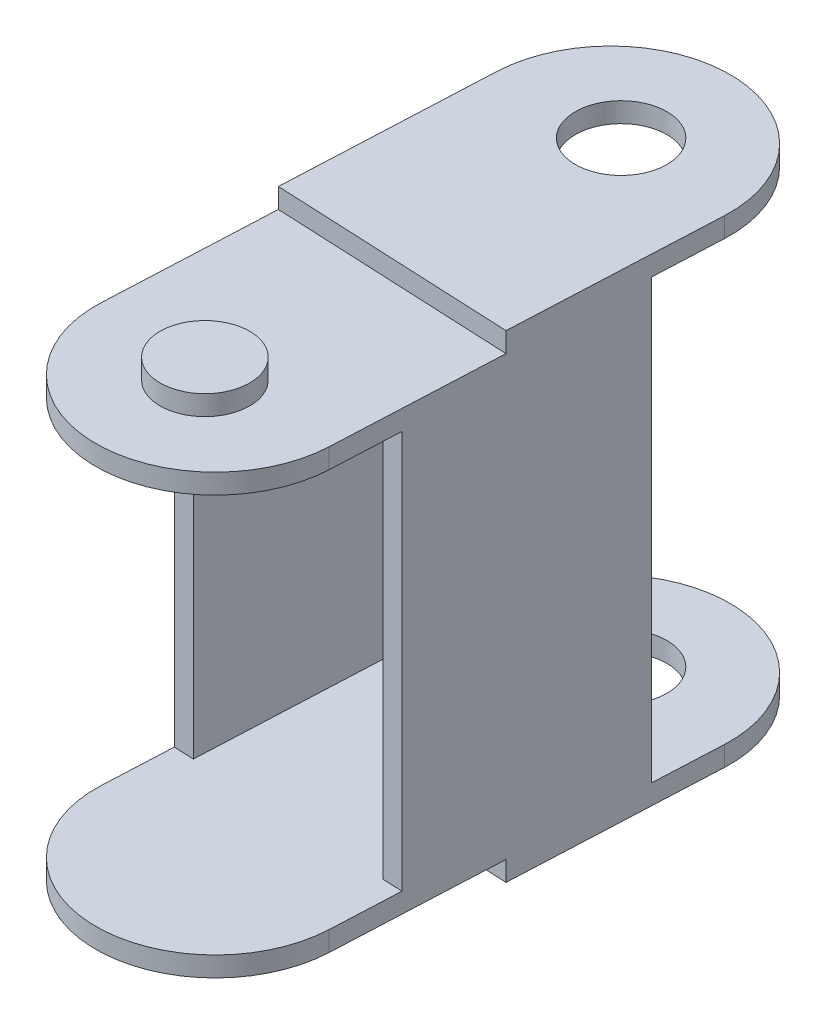
ISO-10303-21;
HEADER;
FILE_DESCRIPTION(('STEP AP214'),'2;1');
FILE_NAME('part.step','',(''),(''),'','','');
FILE_SCHEMA(('AUTOMOTIVE_DESIGN { 1 0 10303 214 1 1 1 1 }'));
ENDSEC;
DATA;
#1=APPLICATION_CONTEXT('core data for automotive mechanical design processes');
#2=APPLICATION_PROTOCOL_DEFINITION('international standard','automotive_design',2000,#1);
#3=PRODUCT_CONTEXT('',#1,'mechanical');
#4=PRODUCT('Part','Part','',(#3));
#5=PRODUCT_RELATED_PRODUCT_CATEGORY('part','',(#4));
#6=PRODUCT_DEFINITION_FORMATION('','',#4);
#7=PRODUCT_DEFINITION_CONTEXT('part definition',#1,'design');
#8=PRODUCT_DEFINITION('design','',#6,#7);
#9=PRODUCT_DEFINITION_SHAPE('','',#8);
#10=(LENGTH_UNIT() NAMED_UNIT(*) SI_UNIT(.MILLI.,.METRE.));
#11=(NAMED_UNIT(*) PLANE_ANGLE_UNIT() SI_UNIT($,.RADIAN.));
#12=(NAMED_UNIT(*) SI_UNIT($,.STERADIAN.) SOLID_ANGLE_UNIT());
#13=UNCERTAINTY_MEASURE_WITH_UNIT(LENGTH_MEASURE(1.E-05),#10,'distance_accuracy_value','');
#14=(GEOMETRIC_REPRESENTATION_CONTEXT(3) GLOBAL_UNCERTAINTY_ASSIGNED_CONTEXT((#13)) GLOBAL_UNIT_ASSIGNED_CONTEXT((#10,
#11,#12)) REPRESENTATION_CONTEXT('',''));
#15=CARTESIAN_POINT('',(0.,0.,0.));
#16=DIRECTION('',(0.,0.,1.));
#17=DIRECTION('',(1.,0.,0.));
#18=AXIS2_PLACEMENT_3D('',#15,#16,#17);
#19=CARTESIAN_POINT('',(-569.3321686826,21.5,46.4624581746));
#20=DIRECTION('',(0.,1.,0.));
#21=DIRECTION('',(-0.046215859100462,0.,0.998931476312368));
#22=AXIS2_PLACEMENT_3D('',#19,#20,#21);
#23=CYLINDRICAL_SURFACE('',#22,2.25);
#24=CARTESIAN_POINT('',(-569.3321686826,21.,46.4624581746));
#25=DIRECTION('',(0.,1.,0.));
#26=DIRECTION('',(-0.046215859100458,0.,0.998931476312368));
#27=AXIS2_PLACEMENT_3D('',#24,#25,#26);
#28=CIRCLE('',#27,2.25);
#29=CARTESIAN_POINT('',(-569.436154365576,21.,48.7100539963028));
#30=VERTEX_POINT('',#29);
#31=EDGE_CURVE('E205',#30,#30,#28,.F.);
#32=ORIENTED_EDGE('',*,*,#31,.F.);
#33=EDGE_LOOP('',(#32));
#34=FACE_BOUND('',#33,.T.);
#35=CARTESIAN_POINT('',(-569.3321686826,22.,46.4624581746));
#36=DIRECTION('',(0.,-1.,0.));
#37=DIRECTION('',(0.046215859100458,0.,-0.998931476312368));
#38=AXIS2_PLACEMENT_3D('',#35,#36,#37);
#39=CIRCLE('',#38,2.25);
#40=CARTESIAN_POINT('',(-569.228182999624,22.,44.2148623528972));
#41=VERTEX_POINT('',#40);
#42=EDGE_CURVE('E202',#41,#41,#39,.F.);
#43=ORIENTED_EDGE('',*,*,#42,.F.);
#44=EDGE_LOOP('',(#43));
#45=FACE_BOUND('',#44,.T.);
#46=ADVANCED_FACE('F17',(#34,#45),#23,.T.);
#47=CARTESIAN_POINT('',(-562.922637092931,21.,37.749370042622));
#48=DIRECTION('',(0.,1.,0.));
#49=DIRECTION('',(-0.998931476312362,0.,-0.046215859100588));
#50=AXIS2_PLACEMENT_3D('',#47,#48,#49);
#51=PLANE('',#50);
#52=CARTESIAN_POINT('',(-569.309060753145,21.,45.962992436339));
#53=DIRECTION('',(0.,1.,0.));
#54=DIRECTION('',(-0.046215859084005,0.,0.998931476313129));
#55=AXIS2_PLACEMENT_3D('',#52,#53,#54);
#56=CIRCLE('',#55,6.);
#57=CARTESIAN_POINT('',(-563.315471895272,21.,46.240287590968));
#58=VERTEX_POINT('',#57);
#59=CARTESIAN_POINT('',(-575.302649610952,21.,45.685697281743));
#60=VERTEX_POINT('',#59);
#61=EDGE_CURVE('E189',#58,#60,#56,.F.);
#62=ORIENTED_EDGE('',*,*,#61,.F.);
#63=DIRECTION('',(0.046215859104167,0.,-0.998931476312196));
#64=VECTOR('',#63,1.);
#65=CARTESIAN_POINT('',(-563.315471895308,21.,46.240287590966));
#66=LINE('',#65,#64);
#67=CARTESIAN_POINT('',(-562.922637092936,21.,37.749370042622));
#68=VERTEX_POINT('',#67);
#69=EDGE_CURVE('E177',#68,#58,#66,.F.);
#70=ORIENTED_EDGE('',*,*,#69,.F.);
#71=DIRECTION('',(-0.998931476312362,0.,-0.046215859100592));
#72=VECTOR('',#71,1.);
#73=CARTESIAN_POINT('',(-562.922637092936,21.,37.749370042622));
#74=LINE('',#73,#72);
#75=CARTESIAN_POINT('',(-574.909814809,21.,37.1947797334));
#76=VERTEX_POINT('',#75);
#77=EDGE_CURVE('E188',#76,#68,#74,.F.);
#78=ORIENTED_EDGE('',*,*,#77,.F.);
#79=DIRECTION('',(-0.046215859055019,0.,0.99893147631447));
#80=VECTOR('',#79,1.);
#81=CARTESIAN_POINT('',(-574.909814809,21.,37.1947797334));
#82=LINE('',#81,#80);
#83=EDGE_CURVE('E201',#60,#76,#82,.F.);
#84=ORIENTED_EDGE('',*,*,#83,.F.);
#85=EDGE_LOOP('',(#62,#70,#78,#84));
#86=FACE_BOUND('',#85,.T.);
#87=ORIENTED_EDGE('',*,*,#31,.T.);
#88=EDGE_LOOP('',(#87));
#89=FACE_BOUND('',#88,.T.);
#90=ADVANCED_FACE('F199',(#86,#89),#51,.T.);
#91=CARTESIAN_POINT('',(-571.535914929974,22.,44.108094455134));
#92=DIRECTION('',(0.,1.,0.));
#93=DIRECTION('',(-0.046215859100588,0.,0.998931476312362));
#94=AXIS2_PLACEMENT_3D('',#91,#92,#93);
#95=PLANE('',#94);
#96=ORIENTED_EDGE('',*,*,#42,.T.);
#97=EDGE_LOOP('',(#96));
#98=FACE_BOUND('',#97,.T.);
#99=ADVANCED_FACE('F629',(#98),#95,.T.);
#100=CARTESIAN_POINT('',(-569.309060752945,-2.,45.962992436349));
#101=DIRECTION('',(0.,1.,0.));
#102=DIRECTION('',(-0.998931476312394,0.,-0.046215859099892));
#103=AXIS2_PLACEMENT_3D('',#100,#101,#102);
#104=CYLINDRICAL_SURFACE('',#103,6.);
#105=DIRECTION('',(-9.09E-13,-1.,2.0755E-11));
#106=VECTOR('',#105,1.);
#107=CARTESIAN_POINT('',(-575.302649610819,21.,45.685697281749));
#108=LINE('',#107,#106);
#109=CARTESIAN_POINT('',(-575.30264961082,20.,45.68569728177));
#110=VERTEX_POINT('',#109);
#111=EDGE_CURVE('E217',#110,#60,#108,.F.);
#112=ORIENTED_EDGE('',*,*,#111,.F.);
#113=CARTESIAN_POINT('',(-569.309060752945,20.,45.962992436349));
#114=DIRECTION('',(0.,1.,0.));
#115=DIRECTION('',(-0.998931476312554,0.,-0.046215859096433));
#116=AXIS2_PLACEMENT_3D('',#113,#114,#115);
#117=CIRCLE('',#116,6.);
#118=CARTESIAN_POINT('',(-563.315471895271,20.,46.240287590952));
#119=VERTEX_POINT('',#118);
#120=EDGE_CURVE('E196',#110,#119,#117,.T.);
#121=ORIENTED_EDGE('',*,*,#120,.T.);
#122=DIRECTION('',(-7.96E-13,1.,1.5696E-11));
#123=VECTOR('',#122,1.);
#124=CARTESIAN_POINT('',(-563.315471895271,20.,46.240287590952));
#125=LINE('',#124,#123);
#126=EDGE_CURVE('E181',#119,#58,#125,.T.);
#127=ORIENTED_EDGE('',*,*,#126,.T.);
#128=ORIENTED_EDGE('',*,*,#61,.T.);
#129=EDGE_LOOP('',(#112,#121,#127,#128));
#130=FACE_BOUND('',#129,.T.);
#131=ADVANCED_FACE('F195',(#130),#104,.T.);
#132=CARTESIAN_POINT('',(-563.315471895176,-2.,46.240287591047));
#133=DIRECTION('',(0.998931476312362,0.,0.046215859100588));
#134=DIRECTION('',(0.046215859100588,0.,-0.998931476312362));
#135=AXIS2_PLACEMENT_3D('',#132,#133,#134);
#136=PLANE('',#135);
#137=DIRECTION('',(0.,-1.,0.));
#138=VECTOR('',#137,1.);
#139=CARTESIAN_POINT('',(-562.922637092831,22.,37.749370042627));
#140=LINE('',#139,#138);
#141=CARTESIAN_POINT('',(-562.922637092831,22.,37.749370042627));
#142=VERTEX_POINT('',#141);
#143=EDGE_CURVE('E184',#142,#68,#140,.T.);
#144=ORIENTED_EDGE('',*,*,#143,.T.);
#145=ORIENTED_EDGE('',*,*,#69,.T.);
#146=ORIENTED_EDGE('',*,*,#126,.F.);
#147=DIRECTION('',(0.046215859100581,0.,-0.998931476312362));
#148=VECTOR('',#147,1.);
#149=CARTESIAN_POINT('',(-563.315471895171,20.,46.240287590957));
#150=LINE('',#149,#148);
#151=CARTESIAN_POINT('',(-563.153716388336,20.,42.744027424217));
#152=VERTEX_POINT('',#151);
#153=EDGE_CURVE('E229',#119,#152,#150,.T.);
#154=ORIENTED_EDGE('',*,*,#153,.T.);
#155=DIRECTION('',(0.,-1.,0.));
#156=VECTOR('',#155,1.);
#157=CARTESIAN_POINT('',(-563.153716388336,20.,42.744027424217));
#158=LINE('',#157,#156);
#159=CARTESIAN_POINT('',(-563.153716388336,0.,42.744027424217));
#160=VERTEX_POINT('',#159);
#161=EDGE_CURVE('E233',#152,#160,#158,.T.);
#162=ORIENTED_EDGE('',*,*,#161,.T.);
#163=DIRECTION('',(-0.046215859100602,0.,0.998931476312361));
#164=VECTOR('',#163,1.);
#165=CARTESIAN_POINT('',(-563.153716388336,0.,42.744027424217));
#166=LINE('',#165,#164);
#167=CARTESIAN_POINT('',(-563.315471895172,0.,46.240287590972));
#168=VERTEX_POINT('',#167);
#169=EDGE_CURVE('E238',#160,#168,#166,.T.);
#170=ORIENTED_EDGE('',*,*,#169,.T.);
#171=DIRECTION('',(-1.14E-13,-1.,4.214E-12));
#172=VECTOR('',#171,1.);
#173=CARTESIAN_POINT('',(-563.315471895172,0.,46.240287590972));
#174=LINE('',#173,#172);
#175=CARTESIAN_POINT('',(-563.315471895172,-1.,46.240287590977));
#176=VERTEX_POINT('',#175);
#177=EDGE_CURVE('E243',#176,#168,#174,.F.);
#178=ORIENTED_EDGE('',*,*,#177,.F.);
#179=DIRECTION('',(0.046215859100586,0.,-0.998931476312362));
#180=VECTOR('',#179,1.);
#181=CARTESIAN_POINT('',(-563.315471895172,-1.,46.240287590977));
#182=LINE('',#181,#180);
#183=CARTESIAN_POINT('',(-562.922637092831,-1.,37.749370042627));
#184=VERTEX_POINT('',#183);
#185=EDGE_CURVE('E247',#176,#184,#182,.T.);
#186=ORIENTED_EDGE('',*,*,#185,.T.);
#187=DIRECTION('',(0.,-1.,0.));
#188=VECTOR('',#187,1.);
#189=CARTESIAN_POINT('',(-562.922637092831,-1.,37.749370042627));
#190=LINE('',#189,#188);
#191=CARTESIAN_POINT('',(-562.922637092831,-2.,37.749370042627));
#192=VERTEX_POINT('',#191);
#193=EDGE_CURVE('E252',#184,#192,#190,.T.);
#194=ORIENTED_EDGE('',*,*,#193,.T.);
#195=DIRECTION('',(0.046215859100592,0.,-0.998931476312362));
#196=VECTOR('',#195,1.);
#197=CARTESIAN_POINT('',(-562.922637092831,-2.,37.749370042627));
#198=LINE('',#197,#196);
#199=CARTESIAN_POINT('',(-562.437370572264,-2.,27.260589541112));
#200=VERTEX_POINT('',#199);
#201=EDGE_CURVE('E257',#192,#200,#198,.T.);
#202=ORIENTED_EDGE('',*,*,#201,.T.);
#203=DIRECTION('',(0.,1.,0.));
#204=VECTOR('',#203,1.);
#205=CARTESIAN_POINT('',(-562.437370572264,-2.,27.260589541112));
#206=LINE('',#205,#204);
#207=CARTESIAN_POINT('',(-562.437370572264,-1.,27.260589541112));
#208=VERTEX_POINT('',#207);
#209=EDGE_CURVE('E262',#200,#208,#206,.T.);
#210=ORIENTED_EDGE('',*,*,#209,.T.);
#211=DIRECTION('',(-0.046215859100593,0.,0.998931476312362));
#212=VECTOR('',#211,1.);
#213=CARTESIAN_POINT('',(-562.437370572264,-1.,27.260589541112));
#214=LINE('',#213,#212);
#215=CARTESIAN_POINT('',(-562.599126079129,-1.,30.756849708475));
#216=VERTEX_POINT('',#215);
#217=EDGE_CURVE('E267',#208,#216,#214,.T.);
#218=ORIENTED_EDGE('',*,*,#217,.T.);
#219=DIRECTION('',(0.,1.,0.));
#220=VECTOR('',#219,1.);
#221=CARTESIAN_POINT('',(-562.599126079129,-1.,30.756849708475));
#222=LINE('',#221,#220);
#223=CARTESIAN_POINT('',(-562.599126079129,21.,30.756849708475));
#224=VERTEX_POINT('',#223);
#225=EDGE_CURVE('E272',#216,#224,#222,.T.);
#226=ORIENTED_EDGE('',*,*,#225,.T.);
#227=DIRECTION('',(0.046215859100593,0.,-0.998931476312362));
#228=VECTOR('',#227,1.);
#229=CARTESIAN_POINT('',(-562.599126079129,21.,30.756849708475));
#230=LINE('',#229,#228);
#231=CARTESIAN_POINT('',(-562.437370572264,21.,27.260589541112));
#232=VERTEX_POINT('',#231);
#233=EDGE_CURVE('E277',#224,#232,#230,.T.);
#234=ORIENTED_EDGE('',*,*,#233,.T.);
#235=DIRECTION('',(0.,1.,0.));
#236=VECTOR('',#235,1.);
#237=CARTESIAN_POINT('',(-562.437370572264,21.,27.260589541112));
#238=LINE('',#237,#236);
#239=CARTESIAN_POINT('',(-562.437370572264,22.,27.260589541112));
#240=VERTEX_POINT('',#239);
#241=EDGE_CURVE('E282',#232,#240,#238,.T.);
#242=ORIENTED_EDGE('',*,*,#241,.T.);
#243=DIRECTION('',(-0.046215859100592,0.,0.998931476312362));
#244=VECTOR('',#243,1.);
#245=CARTESIAN_POINT('',(-562.437370572264,22.,27.260589541112));
#246=LINE('',#245,#244);
#247=EDGE_CURVE('E287',#240,#142,#246,.T.);
#248=ORIENTED_EDGE('',*,*,#247,.T.);
#249=EDGE_LOOP('',(#144,#145,#146,#154,#162,#170,#178,#186,#194,#202,#210,#218,#226,#234,#242,#248));
#250=FACE_BOUND('',#249,.T.);
#251=ADVANCED_FACE('F179',(#250),#136,.T.);
#252=CARTESIAN_POINT('',(-574.909814809,21.,37.1947797334));
#253=DIRECTION('',(-0.046215859100588,0.,0.998931476312362));
#254=DIRECTION('',(0.998931476312362,0.,0.046215859100588));
#255=AXIS2_PLACEMENT_3D('',#252,#253,#254);
#256=PLANE('',#255);
#257=DIRECTION('',(-0.998931476312362,0.,-0.046215859100589));
#258=VECTOR('',#257,1.);
#259=CARTESIAN_POINT('',(-562.922637092937,22.,37.749370042622));
#260=LINE('',#259,#258);
#261=CARTESIAN_POINT('',(-574.909814808918,22.,37.194779733404));
#262=VERTEX_POINT('',#261);
#263=EDGE_CURVE('E291',#262,#142,#260,.F.);
#264=ORIENTED_EDGE('',*,*,#263,.F.);
#265=DIRECTION('',(-8.1627E-11,-1.,-3.773E-12));
#266=VECTOR('',#265,1.);
#267=CARTESIAN_POINT('',(-574.909814808918,22.,37.194779733404));
#268=LINE('',#267,#266);
#269=EDGE_CURVE('E295',#76,#262,#268,.F.);
#270=ORIENTED_EDGE('',*,*,#269,.F.);
#271=ORIENTED_EDGE('',*,*,#77,.T.);
#272=ORIENTED_EDGE('',*,*,#143,.F.);
#273=EDGE_LOOP('',(#264,#270,#271,#272));
#274=FACE_BOUND('',#273,.T.);
#275=ADVANCED_FACE('F613',(#274),#256,.T.);
#276=CARTESIAN_POINT('',(-574.424548288013,-2.,26.705999231905));
#277=DIRECTION('',(-0.998931476312362,0.,-0.046215859100588));
#278=DIRECTION('',(-0.046215859100588,0.,0.998931476312362));
#279=AXIS2_PLACEMENT_3D('',#276,#277,#278);
#280=PLANE('',#279);
#281=ORIENTED_EDGE('',*,*,#83,.T.);
#282=ORIENTED_EDGE('',*,*,#269,.T.);
#283=DIRECTION('',(0.046215859100592,0.,-0.998931476312362));
#284=VECTOR('',#283,1.);
#285=CARTESIAN_POINT('',(-574.90981480858,22.,37.194779733419));
#286=LINE('',#285,#284);
#287=CARTESIAN_POINT('',(-574.424548288013,22.,26.705999231905));
#288=VERTEX_POINT('',#287);
#289=EDGE_CURVE('E300',#262,#288,#286,.T.);
#290=ORIENTED_EDGE('',*,*,#289,.T.);
#291=DIRECTION('',(0.,-1.,0.));
#292=VECTOR('',#291,1.);
#293=CARTESIAN_POINT('',(-574.424548288013,22.,26.705999231905));
#294=LINE('',#293,#292);
#295=CARTESIAN_POINT('',(-574.424548288013,21.,26.705999231905));
#296=VERTEX_POINT('',#295);
#297=EDGE_CURVE('E305',#296,#288,#294,.F.);
#298=ORIENTED_EDGE('',*,*,#297,.F.);
#299=DIRECTION('',(-0.046215859100593,0.,0.998931476312362));
#300=VECTOR('',#299,1.);
#301=CARTESIAN_POINT('',(-574.424548288013,21.,26.705999231905));
#302=LINE('',#301,#300);
#303=CARTESIAN_POINT('',(-574.586303794877,21.,30.202259399268));
#304=VERTEX_POINT('',#303);
#305=EDGE_CURVE('E310',#296,#304,#302,.T.);
#306=ORIENTED_EDGE('',*,*,#305,.T.);
#307=DIRECTION('',(0.,-1.,0.));
#308=VECTOR('',#307,1.);
#309=CARTESIAN_POINT('',(-574.586303794877,21.,30.202259399268));
#310=LINE('',#309,#308);
#311=CARTESIAN_POINT('',(-574.586303794877,-1.,30.202259399268));
#312=VERTEX_POINT('',#311);
#313=EDGE_CURVE('E315',#304,#312,#310,.T.);
#314=ORIENTED_EDGE('',*,*,#313,.T.);
#315=DIRECTION('',(0.046215859100592,0.,-0.998931476312362));
#316=VECTOR('',#315,1.);
#317=CARTESIAN_POINT('',(-574.586303794877,-1.,30.202259399268));
#318=LINE('',#317,#316);
#319=CARTESIAN_POINT('',(-574.424548288013,-1.,26.705999231905));
#320=VERTEX_POINT('',#319);
#321=EDGE_CURVE('E320',#312,#320,#318,.T.);
#322=ORIENTED_EDGE('',*,*,#321,.T.);
#323=DIRECTION('',(0.,-1.,0.));
#324=VECTOR('',#323,1.);
#325=CARTESIAN_POINT('',(-574.424548288013,-1.,26.705999231905));
#326=LINE('',#325,#324);
#327=CARTESIAN_POINT('',(-574.424548288013,-2.,26.705999231905));
#328=VERTEX_POINT('',#327);
#329=EDGE_CURVE('E325',#328,#320,#326,.F.);
#330=ORIENTED_EDGE('',*,*,#329,.F.);
#331=DIRECTION('',(-0.046215859100592,0.,0.998931476312362));
#332=VECTOR('',#331,1.);
#333=CARTESIAN_POINT('',(-574.424548288013,-2.,26.705999231905));
#334=LINE('',#333,#332);
#335=CARTESIAN_POINT('',(-574.90981480858,-2.,37.194779733419));
#336=VERTEX_POINT('',#335);
#337=EDGE_CURVE('E330',#328,#336,#334,.T.);
#338=ORIENTED_EDGE('',*,*,#337,.T.);
#339=DIRECTION('',(0.,1.,0.));
#340=VECTOR('',#339,1.);
#341=CARTESIAN_POINT('',(-574.90981480858,-2.,37.194779733419));
#342=LINE('',#341,#340);
#343=CARTESIAN_POINT('',(-574.90981480858,-1.,37.194779733419));
#344=VERTEX_POINT('',#343);
#345=EDGE_CURVE('E335',#336,#344,#342,.T.);
#346=ORIENTED_EDGE('',*,*,#345,.T.);
#347=DIRECTION('',(-0.046215859100588,0.,0.998931476312362));
#348=VECTOR('',#347,1.);
#349=CARTESIAN_POINT('',(-574.90981480858,-1.,37.194779733419));
#350=LINE('',#349,#348);
#351=CARTESIAN_POINT('',(-575.302649610919,-1.,45.685697281745));
#352=VERTEX_POINT('',#351);
#353=EDGE_CURVE('E340',#344,#352,#350,.T.);
#354=ORIENTED_EDGE('',*,*,#353,.T.);
#355=DIRECTION('',(-2.27E-13,1.,4.988E-12));
#356=VECTOR('',#355,1.);
#357=CARTESIAN_POINT('',(-575.302649610919,-1.,45.685697281745));
#358=LINE('',#357,#356);
#359=CARTESIAN_POINT('',(-575.30264961092,0.,45.68569728175));
#360=VERTEX_POINT('',#359);
#361=EDGE_CURVE('E345',#352,#360,#358,.T.);
#362=ORIENTED_EDGE('',*,*,#361,.T.);
#363=DIRECTION('',(0.046215859100614,0.,-0.998931476312361));
#364=VECTOR('',#363,1.);
#365=CARTESIAN_POINT('',(-575.30264961092,0.,45.68569728175));
#366=LINE('',#365,#364);
#367=CARTESIAN_POINT('',(-575.140894104084,0.,42.18943711501));
#368=VERTEX_POINT('',#367);
#369=EDGE_CURVE('E350',#360,#368,#366,.T.);
#370=ORIENTED_EDGE('',*,*,#369,.T.);
#371=DIRECTION('',(0.,1.,0.));
#372=VECTOR('',#371,1.);
#373=CARTESIAN_POINT('',(-575.140894104084,0.,42.18943711501));
#374=LINE('',#373,#372);
#375=CARTESIAN_POINT('',(-575.140894104084,20.,42.18943711501));
#376=VERTEX_POINT('',#375);
#377=EDGE_CURVE('E355',#368,#376,#374,.T.);
#378=ORIENTED_EDGE('',*,*,#377,.T.);
#379=DIRECTION('',(-0.046215859100601,0.,0.998931476312361));
#380=VECTOR('',#379,1.);
#381=CARTESIAN_POINT('',(-575.140894104084,20.,42.18943711501));
#382=LINE('',#381,#380);
#383=EDGE_CURVE('E360',#376,#110,#382,.T.);
#384=ORIENTED_EDGE('',*,*,#383,.T.);
#385=ORIENTED_EDGE('',*,*,#111,.T.);
#386=EDGE_LOOP('',(#281,#282,#290,#298,#306,#314,#322,#330,#338,#346,#354,#362,#370,#378,#384,#385));
#387=FACE_BOUND('',#386,.T.);
#388=ADVANCED_FACE('F555',(#387),#280,.T.);
#389=CARTESIAN_POINT('',(-574.586303794931,20.,30.202259399266));
#390=DIRECTION('',(0.,-1.,0.));
#391=DIRECTION('',(0.998931476312362,0.,0.046215859100588));
#392=AXIS2_PLACEMENT_3D('',#389,#390,#391);
#393=PLANE('',#392);
#394=CARTESIAN_POINT('',(-568.407851500588,20.,26.483828648353));
#395=DIRECTION('',(0.,1.,0.));
#396=DIRECTION('',(-0.046215859100621,0.,0.99893147631236));
#397=AXIS2_PLACEMENT_3D('',#394,#395,#396);
#398=CIRCLE('',#397,6.2);
#399=CARTESIAN_POINT('',(-573.324740959274,20.,30.260625975595));
#400=VERTEX_POINT('',#399);
#401=CARTESIAN_POINT('',(-563.860688914732,20.,30.69848313215));
#402=VERTEX_POINT('',#401);
#403=EDGE_CURVE('E365',#400,#402,#398,.T.);
#404=ORIENTED_EDGE('',*,*,#403,.T.);
#405=DIRECTION('',(0.998931476312386,0.,0.046215859100066));
#406=VECTOR('',#405,1.);
#407=CARTESIAN_POINT('',(-563.860688914732,20.,30.698483132149));
#408=LINE('',#407,#406);
#409=CARTESIAN_POINT('',(-563.598057555441,20.,30.710633849375));
#410=VERTEX_POINT('',#409);
#411=EDGE_CURVE('E370',#402,#410,#408,.T.);
#412=ORIENTED_EDGE('',*,*,#411,.T.);
#413=DIRECTION('',(-0.04621585910062,0.,0.99893147631236));
#414=VECTOR('',#413,1.);
#415=CARTESIAN_POINT('',(-563.598057555441,20.,30.710633849375));
#416=LINE('',#415,#414);
#417=CARTESIAN_POINT('',(-564.152647864648,20.,42.697811565116));
#418=VERTEX_POINT('',#417);
#419=EDGE_CURVE('E375',#418,#410,#416,.F.);
#420=ORIENTED_EDGE('',*,*,#419,.F.);
#421=DIRECTION('',(0.998931476312364,0.,0.046215859100552));
#422=VECTOR('',#421,1.);
#423=CARTESIAN_POINT('',(-564.152647864648,20.,42.697811565116));
#424=LINE('',#423,#422);
#425=EDGE_CURVE('E379',#152,#418,#424,.F.);
#426=ORIENTED_EDGE('',*,*,#425,.F.);
#427=ORIENTED_EDGE('',*,*,#153,.F.);
#428=ORIENTED_EDGE('',*,*,#120,.F.);
#429=ORIENTED_EDGE('',*,*,#383,.F.);
#430=DIRECTION('',(0.998931476312361,0.,0.046215859100605));
#431=VECTOR('',#430,1.);
#432=CARTESIAN_POINT('',(-575.140894104138,20.,42.189437115007));
#433=LINE('',#432,#431);
#434=CARTESIAN_POINT('',(-574.141962627772,20.,42.235652974111));
#435=VERTEX_POINT('',#434);
#436=EDGE_CURVE('E384',#435,#376,#433,.F.);
#437=ORIENTED_EDGE('',*,*,#436,.F.);
#438=DIRECTION('',(0.04621585910063,0.,-0.99893147631236));
#439=VECTOR('',#438,1.);
#440=CARTESIAN_POINT('',(-574.141962627772,20.,42.235652974111));
#441=LINE('',#440,#439);
#442=CARTESIAN_POINT('',(-573.587372318565,20.,30.248475258369));
#443=VERTEX_POINT('',#442);
#444=EDGE_CURVE('E388',#443,#435,#441,.F.);
#445=ORIENTED_EDGE('',*,*,#444,.F.);
#446=DIRECTION('',(0.998931476312351,0.,0.046215859100828));
#447=VECTOR('',#446,1.);
#448=CARTESIAN_POINT('',(-573.587372318565,20.,30.248475258369));
#449=LINE('',#448,#447);
#450=EDGE_CURVE('E392',#443,#400,#449,.T.);
#451=ORIENTED_EDGE('',*,*,#450,.T.);
#452=EDGE_LOOP('',(#404,#412,#420,#426,#427,#428,#429,#437,#445,#451));
#453=FACE_BOUND('',#452,.T.);
#454=ADVANCED_FACE('F557',(#453),#393,.T.);
#455=CARTESIAN_POINT('',(-564.152647864648,20.,42.697811565116));
#456=DIRECTION('',(-0.046215859100588,0.,0.998931476312362));
#457=DIRECTION('',(0.,-1.,0.));
#458=AXIS2_PLACEMENT_3D('',#455,#456,#457);
#459=PLANE('',#458);
#460=DIRECTION('',(0.,-1.,0.));
#461=VECTOR('',#460,1.);
#462=CARTESIAN_POINT('',(-564.152647864648,20.,42.697811565116));
#463=LINE('',#462,#461);
#464=CARTESIAN_POINT('',(-564.152647864648,0.,42.697811565116));
#465=VERTEX_POINT('',#464);
#466=EDGE_CURVE('E397',#465,#418,#463,.F.);
#467=ORIENTED_EDGE('',*,*,#466,.F.);
#468=DIRECTION('',(0.998931476312362,0.,0.046215859100586));
#469=VECTOR('',#468,1.);
#470=CARTESIAN_POINT('',(-564.152647864648,0.,42.697811565116));
#471=LINE('',#470,#469);
#472=EDGE_CURVE('E401',#465,#160,#471,.T.);
#473=ORIENTED_EDGE('',*,*,#472,.T.);
#474=ORIENTED_EDGE('',*,*,#161,.F.);
#475=ORIENTED_EDGE('',*,*,#425,.T.);
#476=EDGE_LOOP('',(#467,#473,#474,#475));
#477=FACE_BOUND('',#476,.T.);
#478=ADVANCED_FACE('F563',(#477),#459,.T.);
#479=CARTESIAN_POINT('',(-574.586303795039,0.,30.202259399261));
#480=DIRECTION('',(0.,1.,0.));
#481=DIRECTION('',(-0.046215859100588,0.,0.998931476312362));
#482=AXIS2_PLACEMENT_3D('',#479,#480,#481);
#483=PLANE('',#482);
#484=CARTESIAN_POINT('',(-568.407851500588,0.,26.483828648353));
#485=DIRECTION('',(0.,-1.,0.));
#486=DIRECTION('',(-0.046215859100621,0.,0.99893147631236));
#487=AXIS2_PLACEMENT_3D('',#484,#485,#486);
#488=CIRCLE('',#487,6.2);
#489=CARTESIAN_POINT('',(-563.860688914732,0.,30.69848313215));
#490=VERTEX_POINT('',#489);
#491=CARTESIAN_POINT('',(-573.324740959274,0.,30.260625975595));
#492=VERTEX_POINT('',#491);
#493=EDGE_CURVE('E406',#490,#492,#488,.T.);
#494=ORIENTED_EDGE('',*,*,#493,.T.);
#495=DIRECTION('',(-0.998931476312357,0.,-0.046215859100694));
#496=VECTOR('',#495,1.);
#497=CARTESIAN_POINT('',(-573.324740959274,0.,30.260625975595));
#498=LINE('',#497,#496);
#499=CARTESIAN_POINT('',(-573.587372318565,0.,30.248475258369));
#500=VERTEX_POINT('',#499);
#501=EDGE_CURVE('E411',#492,#500,#498,.T.);
#502=ORIENTED_EDGE('',*,*,#501,.T.);
#503=DIRECTION('',(-0.046215859100591,0.,0.998931476312362));
#504=VECTOR('',#503,1.);
#505=CARTESIAN_POINT('',(-573.587372318565,0.,30.248475258369));
#506=LINE('',#505,#504);
#507=CARTESIAN_POINT('',(-574.141962627772,0.,42.235652974111));
#508=VERTEX_POINT('',#507);
#509=EDGE_CURVE('E416',#508,#500,#506,.F.);
#510=ORIENTED_EDGE('',*,*,#509,.F.);
#511=DIRECTION('',(-0.99893147631236,0.,-0.046215859100639));
#512=VECTOR('',#511,1.);
#513=CARTESIAN_POINT('',(-574.141962627772,0.,42.235652974111));
#514=LINE('',#513,#512);
#515=EDGE_CURVE('E420',#368,#508,#514,.F.);
#516=ORIENTED_EDGE('',*,*,#515,.F.);
#517=ORIENTED_EDGE('',*,*,#369,.F.);
#518=CARTESIAN_POINT('',(-569.309060753145,0.,45.962992436339));
#519=DIRECTION('',(0.,1.,0.));
#520=DIRECTION('',(-0.046215859083986,0.,0.99893147631313));
#521=AXIS2_PLACEMENT_3D('',#518,#519,#520);
#522=CIRCLE('',#521,6.);
#523=EDGE_CURVE('E425',#168,#360,#522,.F.);
#524=ORIENTED_EDGE('',*,*,#523,.F.);
#525=ORIENTED_EDGE('',*,*,#169,.F.);
#526=ORIENTED_EDGE('',*,*,#472,.F.);
#527=DIRECTION('',(0.046215859100601,0.,-0.998931476312361));
#528=VECTOR('',#527,1.);
#529=CARTESIAN_POINT('',(-564.152647864648,0.,42.697811565116));
#530=LINE('',#529,#528);
#531=CARTESIAN_POINT('',(-563.598057555441,0.,30.710633849375));
#532=VERTEX_POINT('',#531);
#533=EDGE_CURVE('E429',#532,#465,#530,.F.);
#534=ORIENTED_EDGE('',*,*,#533,.F.);
#535=DIRECTION('',(-0.998931476312414,0.,-0.046215859099466));
#536=VECTOR('',#535,1.);
#537=CARTESIAN_POINT('',(-563.598057555441,0.,30.710633849375));
#538=LINE('',#537,#536);
#539=EDGE_CURVE('E433',#532,#490,#538,.T.);
#540=ORIENTED_EDGE('',*,*,#539,.T.);
#541=EDGE_LOOP('',(#494,#502,#510,#516,#517,#524,#525,#526,#534,#540));
#542=FACE_BOUND('',#541,.T.);
#543=ADVANCED_FACE('F549',(#542),#483,.T.);
#544=CARTESIAN_POINT('',(-569.309060753145,-2.,45.962992436339));
#545=DIRECTION('',(0.,1.,0.));
#546=DIRECTION('',(-0.046215859084011,0.,0.998931476313129));
#547=AXIS2_PLACEMENT_3D('',#544,#545,#546);
#548=CYLINDRICAL_SURFACE('',#547,6.);
#549=ORIENTED_EDGE('',*,*,#177,.T.);
#550=ORIENTED_EDGE('',*,*,#523,.T.);
#551=ORIENTED_EDGE('',*,*,#361,.F.);
#552=CARTESIAN_POINT('',(-569.309060752945,-1.,45.962992436349));
#553=DIRECTION('',(0.,-1.,0.));
#554=DIRECTION('',(-0.046215859117335,0.,0.998931476311587));
#555=AXIS2_PLACEMENT_3D('',#552,#553,#554);
#556=CIRCLE('',#555,6.);
#557=EDGE_CURVE('E438',#352,#176,#556,.F.);
#558=ORIENTED_EDGE('',*,*,#557,.T.);
#559=EDGE_LOOP('',(#549,#550,#551,#558));
#560=FACE_BOUND('',#559,.T.);
#561=ADVANCED_FACE('F570',(#560),#548,.T.);
#562=CARTESIAN_POINT('',(-574.909814808685,-1.,37.194779733415));
#563=DIRECTION('',(0.,-1.,0.));
#564=DIRECTION('',(0.998931476312362,0.,0.046215859100588));
#565=AXIS2_PLACEMENT_3D('',#562,#563,#564);
#566=PLANE('',#565);
#567=ORIENTED_EDGE('',*,*,#557,.F.);
#568=ORIENTED_EDGE('',*,*,#353,.F.);
#569=DIRECTION('',(0.998931476312362,0.,0.046215859100591));
#570=VECTOR('',#569,1.);
#571=CARTESIAN_POINT('',(-574.909814808685,-1.,37.194779733415));
#572=LINE('',#571,#570);
#573=EDGE_CURVE('E443',#344,#184,#572,.T.);
#574=ORIENTED_EDGE('',*,*,#573,.T.);
#575=ORIENTED_EDGE('',*,*,#185,.F.);
#576=EDGE_LOOP('',(#567,#568,#574,#575));
#577=FACE_BOUND('',#576,.T.);
#578=CARTESIAN_POINT('',(-569.3321686826,-1.,46.4624581746));
#579=DIRECTION('',(0.,1.,0.));
#580=DIRECTION('',(-0.046215859100509,0.,0.998931476312366));
#581=AXIS2_PLACEMENT_3D('',#578,#579,#580);
#582=CIRCLE('',#581,2.25);
#583=CARTESIAN_POINT('',(-569.436154365576,-1.,48.7100539963028));
#584=VERTEX_POINT('',#583);
#585=EDGE_CURVE('E448',#584,#584,#582,.T.);
#586=ORIENTED_EDGE('',*,*,#585,.T.);
#587=EDGE_LOOP('',(#586));
#588=FACE_BOUND('',#587,.T.);
#589=ADVANCED_FACE('F574',(#577,#588),#566,.T.);
#590=CARTESIAN_POINT('',(-574.909814808685,-2.,37.194779733415));
#591=DIRECTION('',(-0.046215859100588,0.,0.998931476312362));
#592=DIRECTION('',(0.998931476312362,0.,0.046215859100588));
#593=AXIS2_PLACEMENT_3D('',#590,#591,#592);
#594=PLANE('',#593);
#595=ORIENTED_EDGE('',*,*,#573,.F.);
#596=ORIENTED_EDGE('',*,*,#345,.F.);
#597=DIRECTION('',(0.998931476312362,0.,0.046215859100588));
#598=VECTOR('',#597,1.);
#599=CARTESIAN_POINT('',(-574.909814808685,-2.,37.194779733415));
#600=LINE('',#599,#598);
#601=EDGE_CURVE('E453',#192,#336,#600,.F.);
#602=ORIENTED_EDGE('',*,*,#601,.F.);
#603=ORIENTED_EDGE('',*,*,#193,.F.);
#604=EDGE_LOOP('',(#595,#596,#602,#603));
#605=FACE_BOUND('',#604,.T.);
#606=ADVANCED_FACE('F578',(#605),#594,.T.);
#607=CARTESIAN_POINT('',(-574.147253133834,-2.,20.712410374112));
#608=DIRECTION('',(0.,-1.,0.));
#609=DIRECTION('',(0.998931476312362,0.,0.046215859100588));
#610=AXIS2_PLACEMENT_3D('',#607,#608,#609);
#611=PLANE('',#610);
#612=ORIENTED_EDGE('',*,*,#601,.T.);
#613=ORIENTED_EDGE('',*,*,#337,.F.);
#614=CARTESIAN_POINT('',(-568.430959430243,-2.,26.983294386604));
#615=DIRECTION('',(0.,-1.,0.));
#616=DIRECTION('',(0.046215859117164,0.,-0.998931476311595));
#617=AXIS2_PLACEMENT_3D('',#614,#615,#616);
#618=CIRCLE('',#617,6.);
#619=EDGE_CURVE('E455',#200,#328,#618,.F.);
#620=ORIENTED_EDGE('',*,*,#619,.F.);
#621=ORIENTED_EDGE('',*,*,#201,.F.);
#622=EDGE_LOOP('',(#612,#613,#620,#621));
#623=FACE_BOUND('',#622,.T.);
#624=CARTESIAN_POINT('',(-568.4078515014,-2.,26.4838286483));
#625=DIRECTION('',(0.,1.,0.));
#626=DIRECTION('',(-0.046215859100436,0.,0.998931476312369));
#627=AXIS2_PLACEMENT_3D('',#624,#625,#626);
#628=CIRCLE('',#627,2.3);
#629=CARTESIAN_POINT('',(-568.514147977331,-2.,28.7813710438184));
#630=VERTEX_POINT('',#629);
#631=EDGE_CURVE('E459',#630,#630,#628,.T.);
#632=ORIENTED_EDGE('',*,*,#631,.T.);
#633=EDGE_LOOP('',(#632));
#634=FACE_BOUND('',#633,.T.);
#635=ADVANCED_FACE('F581',(#623,#634),#611,.T.);
#636=CARTESIAN_POINT('',(-568.430959430243,-2.,26.983294386604));
#637=DIRECTION('',(0.,1.,0.));
#638=DIRECTION('',(0.998931476313132,0.,0.046215859083943));
#639=AXIS2_PLACEMENT_3D('',#636,#637,#638);
#640=CYLINDRICAL_SURFACE('',#639,6.);
#641=ORIENTED_EDGE('',*,*,#209,.F.);
#642=ORIENTED_EDGE('',*,*,#619,.T.);
#643=ORIENTED_EDGE('',*,*,#329,.T.);
#644=CARTESIAN_POINT('',(-568.430959430043,-1.,26.983294386614));
#645=DIRECTION('',(0.,1.,0.));
#646=DIRECTION('',(0.046215859083834,0.,-0.998931476313137));
#647=AXIS2_PLACEMENT_3D('',#644,#645,#646);
#648=CIRCLE('',#647,6.);
#649=EDGE_CURVE('E464',#320,#208,#648,.F.);
#650=ORIENTED_EDGE('',*,*,#649,.T.);
#651=EDGE_LOOP('',(#641,#642,#643,#650));
#652=FACE_BOUND('',#651,.T.);
#653=ADVANCED_FACE('F587',(#652),#640,.T.);
#654=CARTESIAN_POINT('',(-574.147253135255,-1.,20.712410374046));
#655=DIRECTION('',(0.,1.,0.));
#656=DIRECTION('',(-0.046215859100588,0.,0.998931476312362));
#657=AXIS2_PLACEMENT_3D('',#654,#655,#656);
#658=PLANE('',#657);
#659=ORIENTED_EDGE('',*,*,#217,.F.);
#660=ORIENTED_EDGE('',*,*,#649,.F.);
#661=ORIENTED_EDGE('',*,*,#321,.F.);
#662=DIRECTION('',(0.998931476312357,0.,0.046215859100693));
#663=VECTOR('',#662,1.);
#664=CARTESIAN_POINT('',(-574.586303795337,-1.,30.202259399247));
#665=LINE('',#664,#663);
#666=CARTESIAN_POINT('',(-573.324740959274,-1.,30.260625975595));
#667=VERTEX_POINT('',#666);
#668=EDGE_CURVE('E467',#667,#312,#665,.F.);
#669=ORIENTED_EDGE('',*,*,#668,.F.);
#670=CARTESIAN_POINT('',(-568.407851500588,-1.,26.483828648353));
#671=DIRECTION('',(0.,1.,0.));
#672=DIRECTION('',(-0.04621585910064,0.,0.99893147631236));
#673=AXIS2_PLACEMENT_3D('',#670,#671,#672);
#674=CIRCLE('',#673,6.2);
#675=CARTESIAN_POINT('',(-563.860688914732,-1.,30.69848313215));
#676=VERTEX_POINT('',#675);
#677=EDGE_CURVE('E471',#676,#667,#674,.F.);
#678=ORIENTED_EDGE('',*,*,#677,.F.);
#679=DIRECTION('',(0.998931476312367,0.,0.046215859100471));
#680=VECTOR('',#679,1.);
#681=CARTESIAN_POINT('',(-563.860688914732,-1.,30.698483132149));
#682=LINE('',#681,#680);
#683=EDGE_CURVE('E475',#216,#676,#682,.F.);
#684=ORIENTED_EDGE('',*,*,#683,.F.);
#685=EDGE_LOOP('',(#659,#660,#661,#669,#678,#684));
#686=FACE_BOUND('',#685,.T.);
#687=CARTESIAN_POINT('',(-568.4078515014,-1.,26.4838286483));
#688=DIRECTION('',(0.,-1.,0.));
#689=DIRECTION('',(0.046215859100436,0.,-0.998931476312369));
#690=AXIS2_PLACEMENT_3D('',#687,#688,#689);
#691=CIRCLE('',#690,2.3);
#692=CARTESIAN_POINT('',(-568.301555025469,-1.,24.1862862527815));
#693=VERTEX_POINT('',#692);
#694=EDGE_CURVE('E480',#693,#693,#691,.T.);
#695=ORIENTED_EDGE('',*,*,#694,.T.);
#696=EDGE_LOOP('',(#695));
#697=FACE_BOUND('',#696,.T.);
#698=ADVANCED_FACE('F590',(#686,#697),#658,.T.);
#699=CARTESIAN_POINT('',(-563.860688914732,-1.,30.698483132149));
#700=DIRECTION('',(0.046215859100588,0.,-0.998931476312362));
#701=DIRECTION('',(0.,1.,0.));
#702=AXIS2_PLACEMENT_3D('',#699,#700,#701);
#703=PLANE('',#702);
#704=DIRECTION('',(2.27E-13,1.,0.));
#705=VECTOR('',#704,1.);
#706=CARTESIAN_POINT('',(-563.860688914732,20.,30.698483132149));
#707=LINE('',#706,#705);
#708=CARTESIAN_POINT('',(-563.860688914732,21.,30.698483132149));
#709=VERTEX_POINT('',#708);
#710=EDGE_CURVE('E485',#402,#709,#707,.T.);
#711=ORIENTED_EDGE('',*,*,#710,.T.);
#712=DIRECTION('',(0.998931476312362,0.,0.046215859100588));
#713=VECTOR('',#712,1.);
#714=CARTESIAN_POINT('',(-563.860688914732,21.,30.698483132149));
#715=LINE('',#714,#713);
#716=EDGE_CURVE('E487',#709,#224,#715,.T.);
#717=ORIENTED_EDGE('',*,*,#716,.T.);
#718=ORIENTED_EDGE('',*,*,#225,.F.);
#719=ORIENTED_EDGE('',*,*,#683,.T.);
#720=DIRECTION('',(-1.14E-13,1.,0.));
#721=VECTOR('',#720,1.);
#722=CARTESIAN_POINT('',(-563.860688914732,-1.,30.698483132149));
#723=LINE('',#722,#721);
#724=EDGE_CURVE('E492',#676,#490,#723,.T.);
#725=ORIENTED_EDGE('',*,*,#724,.T.);
#726=ORIENTED_EDGE('',*,*,#539,.F.);
#727=DIRECTION('',(0.,1.,0.));
#728=VECTOR('',#727,1.);
#729=CARTESIAN_POINT('',(-563.598057555441,0.,30.710633849375));
#730=LINE('',#729,#728);
#731=EDGE_CURVE('E497',#410,#532,#730,.F.);
#732=ORIENTED_EDGE('',*,*,#731,.F.);
#733=ORIENTED_EDGE('',*,*,#411,.F.);
#734=EDGE_LOOP('',(#711,#717,#718,#719,#725,#726,#732,#733));
#735=FACE_BOUND('',#734,.T.);
#736=ADVANCED_FACE('F595',(#735),#703,.T.);
#737=CARTESIAN_POINT('',(-574.147253135255,21.,20.712410374046));
#738=DIRECTION('',(0.,-1.,0.));
#739=DIRECTION('',(0.998931476312362,0.,0.046215859100588));
#740=AXIS2_PLACEMENT_3D('',#737,#738,#739);
#741=PLANE('',#740);
#742=ORIENTED_EDGE('',*,*,#305,.F.);
#743=CARTESIAN_POINT('',(-568.430959430243,21.,26.983294386604));
#744=DIRECTION('',(0.,-1.,0.));
#745=DIRECTION('',(0.046215859117164,0.,-0.998931476311595));
#746=AXIS2_PLACEMENT_3D('',#743,#744,#745);
#747=CIRCLE('',#746,6.);
#748=EDGE_CURVE('E501',#232,#296,#747,.F.);
#749=ORIENTED_EDGE('',*,*,#748,.F.);
#750=ORIENTED_EDGE('',*,*,#233,.F.);
#751=ORIENTED_EDGE('',*,*,#716,.F.);
#752=CARTESIAN_POINT('',(-568.407851500588,21.,26.483828648353));
#753=DIRECTION('',(0.,-1.,0.));
#754=DIRECTION('',(-0.04621585910064,0.,0.99893147631236));
#755=AXIS2_PLACEMENT_3D('',#752,#753,#754);
#756=CIRCLE('',#755,6.2);
#757=CARTESIAN_POINT('',(-573.324740959274,21.,30.260625975595));
#758=VERTEX_POINT('',#757);
#759=EDGE_CURVE('E36',#758,#709,#756,.F.);
#760=ORIENTED_EDGE('',*,*,#759,.F.);
#761=DIRECTION('',(-0.998931476312358,0.,-0.046215859100662));
#762=VECTOR('',#761,1.);
#763=CARTESIAN_POINT('',(-573.324740959274,21.,30.260625975595));
#764=LINE('',#763,#762);
#765=EDGE_CURVE('E508',#304,#758,#764,.F.);
#766=ORIENTED_EDGE('',*,*,#765,.F.);
#767=EDGE_LOOP('',(#742,#749,#750,#751,#760,#766));
#768=FACE_BOUND('',#767,.T.);
#769=CARTESIAN_POINT('',(-568.4078515014,21.,26.4838286483));
#770=DIRECTION('',(0.,1.,0.));
#771=DIRECTION('',(0.046215859100436,0.,-0.998931476312369));
#772=AXIS2_PLACEMENT_3D('',#769,#770,#771);
#773=CIRCLE('',#772,2.3);
#774=CARTESIAN_POINT('',(-568.301555025469,21.,24.1862862527815));
#775=VERTEX_POINT('',#774);
#776=EDGE_CURVE('E513',#775,#775,#773,.T.);
#777=ORIENTED_EDGE('',*,*,#776,.T.);
#778=EDGE_LOOP('',(#777));
#779=FACE_BOUND('',#778,.T.);
#780=ADVANCED_FACE('F600',(#768,#779),#741,.T.);
#781=CARTESIAN_POINT('',(-568.430959430243,-2.,26.983294386604));
#782=DIRECTION('',(0.,1.,0.));
#783=DIRECTION('',(0.998931476313132,0.,0.046215859083944));
#784=AXIS2_PLACEMENT_3D('',#781,#782,#783);
#785=CYLINDRICAL_SURFACE('',#784,6.);
#786=ORIENTED_EDGE('',*,*,#748,.T.);
#787=ORIENTED_EDGE('',*,*,#297,.T.);
#788=CARTESIAN_POINT('',(-568.430959430043,22.,26.983294386614));
#789=DIRECTION('',(0.,1.,0.));
#790=DIRECTION('',(0.046215859083834,0.,-0.998931476313137));
#791=AXIS2_PLACEMENT_3D('',#788,#789,#790);
#792=CIRCLE('',#791,6.);
#793=EDGE_CURVE('E518',#288,#240,#792,.F.);
#794=ORIENTED_EDGE('',*,*,#793,.T.);
#795=ORIENTED_EDGE('',*,*,#241,.F.);
#796=EDGE_LOOP('',(#786,#787,#794,#795));
#797=FACE_BOUND('',#796,.T.);
#798=ADVANCED_FACE('F605',(#797),#785,.T.);
#799=CARTESIAN_POINT('',(-574.147253133834,22.,20.712410374112));
#800=DIRECTION('',(0.,1.,0.));
#801=DIRECTION('',(-0.046215859100588,0.,0.998931476312362));
#802=AXIS2_PLACEMENT_3D('',#799,#800,#801);
#803=PLANE('',#802);
#804=ORIENTED_EDGE('',*,*,#263,.T.);
#805=ORIENTED_EDGE('',*,*,#247,.F.);
#806=ORIENTED_EDGE('',*,*,#793,.F.);
#807=ORIENTED_EDGE('',*,*,#289,.F.);
#808=EDGE_LOOP('',(#804,#805,#806,#807));
#809=FACE_BOUND('',#808,.T.);
#810=CARTESIAN_POINT('',(-568.4078515014,22.,26.4838286483));
#811=DIRECTION('',(0.,-1.,0.));
#812=DIRECTION('',(-0.046215859100436,0.,0.998931476312369));
#813=AXIS2_PLACEMENT_3D('',#810,#811,#812);
#814=CIRCLE('',#813,2.3);
#815=CARTESIAN_POINT('',(-568.514147977331,22.,28.7813710438184));
#816=VERTEX_POINT('',#815);
#817=EDGE_CURVE('E521',#816,#816,#814,.T.);
#818=ORIENTED_EDGE('',*,*,#817,.T.);
#819=EDGE_LOOP('',(#818));
#820=FACE_BOUND('',#819,.T.);
#821=ADVANCED_FACE('F608',(#809,#820),#803,.T.);
#822=CARTESIAN_POINT('',(-574.586303796718,-1.,30.202259399183));
#823=DIRECTION('',(0.046215859100588,0.,-0.998931476312362));
#824=DIRECTION('',(0.,1.,0.));
#825=AXIS2_PLACEMENT_3D('',#822,#823,#824);
#826=PLANE('',#825);
#827=DIRECTION('',(0.,-1.,0.));
#828=VECTOR('',#827,1.);
#829=CARTESIAN_POINT('',(-573.324740959274,21.,30.260625975594));
#830=LINE('',#829,#828);
#831=EDGE_CURVE('E32',#758,#400,#830,.T.);
#832=ORIENTED_EDGE('',*,*,#831,.T.);
#833=ORIENTED_EDGE('',*,*,#450,.F.);
#834=DIRECTION('',(0.,-1.,0.));
#835=VECTOR('',#834,1.);
#836=CARTESIAN_POINT('',(-573.587372318565,20.,30.248475258369));
#837=LINE('',#836,#835);
#838=EDGE_CURVE('E527',#500,#443,#837,.F.);
#839=ORIENTED_EDGE('',*,*,#838,.F.);
#840=ORIENTED_EDGE('',*,*,#501,.F.);
#841=DIRECTION('',(0.,-1.,0.));
#842=VECTOR('',#841,1.);
#843=CARTESIAN_POINT('',(-573.324740959274,0.,30.260625975594));
#844=LINE('',#843,#842);
#845=EDGE_CURVE('E531',#492,#667,#844,.T.);
#846=ORIENTED_EDGE('',*,*,#845,.T.);
#847=ORIENTED_EDGE('',*,*,#668,.T.);
#848=ORIENTED_EDGE('',*,*,#313,.F.);
#849=ORIENTED_EDGE('',*,*,#765,.T.);
#850=EDGE_LOOP('',(#832,#833,#839,#840,#846,#847,#848,#849));
#851=FACE_BOUND('',#850,.T.);
#852=ADVANCED_FACE('F781',(#851),#826,.T.);
#853=CARTESIAN_POINT('',(-575.140894104246,20.,42.189437115002));
#854=DIRECTION('',(-0.046215859100588,0.,0.998931476312362));
#855=DIRECTION('',(0.,-1.,0.));
#856=AXIS2_PLACEMENT_3D('',#853,#854,#855);
#857=PLANE('',#856);
#858=DIRECTION('',(0.,1.,0.));
#859=VECTOR('',#858,1.);
#860=CARTESIAN_POINT('',(-574.141962627772,0.,42.235652974111));
#861=LINE('',#860,#859);
#862=EDGE_CURVE('E25',#435,#508,#861,.F.);
#863=ORIENTED_EDGE('',*,*,#862,.F.);
#864=ORIENTED_EDGE('',*,*,#436,.T.);
#865=ORIENTED_EDGE('',*,*,#377,.F.);
#866=ORIENTED_EDGE('',*,*,#515,.T.);
#867=EDGE_LOOP('',(#863,#864,#865,#866));
#868=FACE_BOUND('',#867,.T.);
#869=ADVANCED_FACE('F552',(#868),#857,.T.);
#870=CARTESIAN_POINT('',(-568.407851500588,20.5,26.483828648353));
#871=DIRECTION('',(0.,1.,0.));
#872=DIRECTION('',(-0.793046686884862,0.,0.609160859232555));
#873=AXIS2_PLACEMENT_3D('',#870,#871,#872);
#874=CYLINDRICAL_SURFACE('',#873,6.2);
#875=ORIENTED_EDGE('',*,*,#831,.F.);
#876=ORIENTED_EDGE('',*,*,#759,.T.);
#877=ORIENTED_EDGE('',*,*,#710,.F.);
#878=ORIENTED_EDGE('',*,*,#403,.F.);
#879=EDGE_LOOP('',(#875,#876,#877,#878));
#880=FACE_BOUND('',#879,.T.);
#881=ADVANCED_FACE('F801',(#880),#874,.F.);
#882=CARTESIAN_POINT('',(-563.598057555442,20.,30.710633849375));
#883=DIRECTION('',(-0.998931476312362,0.,-0.046215859100588));
#884=DIRECTION('',(0.,-1.,0.));
#885=AXIS2_PLACEMENT_3D('',#882,#883,#884);
#886=PLANE('',#885);
#887=ORIENTED_EDGE('',*,*,#731,.T.);
#888=ORIENTED_EDGE('',*,*,#533,.T.);
#889=ORIENTED_EDGE('',*,*,#466,.T.);
#890=ORIENTED_EDGE('',*,*,#419,.T.);
#891=EDGE_LOOP('',(#887,#888,#889,#890));
#892=FACE_BOUND('',#891,.T.);
#893=ADVANCED_FACE('F811',(#892),#886,.T.);
#894=CARTESIAN_POINT('',(-573.587372318565,0.,30.248475258369));
#895=DIRECTION('',(0.998931476312362,0.,0.046215859100588));
#896=DIRECTION('',(0.,1.,0.));
#897=AXIS2_PLACEMENT_3D('',#894,#895,#896);
#898=PLANE('',#897);
#899=ORIENTED_EDGE('',*,*,#838,.T.);
#900=ORIENTED_EDGE('',*,*,#444,.T.);
#901=ORIENTED_EDGE('',*,*,#862,.T.);
#902=ORIENTED_EDGE('',*,*,#509,.T.);
#903=EDGE_LOOP('',(#899,#900,#901,#902));
#904=FACE_BOUND('',#903,.T.);
#905=ADVANCED_FACE('F542',(#904),#898,.T.);
#906=CARTESIAN_POINT('',(-568.407851500588,-0.5,26.483828648353));
#907=DIRECTION('',(0.,1.,0.));
#908=DIRECTION('',(-0.046215859100641,0.,0.998931476312359));
#909=AXIS2_PLACEMENT_3D('',#906,#907,#908);
#910=CYLINDRICAL_SURFACE('',#909,6.2);
#911=ORIENTED_EDGE('',*,*,#724,.F.);
#912=ORIENTED_EDGE('',*,*,#677,.T.);
#913=ORIENTED_EDGE('',*,*,#845,.F.);
#914=ORIENTED_EDGE('',*,*,#493,.F.);
#915=EDGE_LOOP('',(#911,#912,#913,#914));
#916=FACE_BOUND('',#915,.T.);
#917=ADVANCED_FACE('F831',(#916),#910,.F.);
#918=CARTESIAN_POINT('',(-569.3321686826,-1.5,46.4624581746));
#919=DIRECTION('',(0.,1.,0.));
#920=DIRECTION('',(-0.046215859100509,0.,0.998931476312366));
#921=AXIS2_PLACEMENT_3D('',#918,#919,#920);
#922=CYLINDRICAL_SURFACE('',#921,2.25);
#923=CARTESIAN_POINT('',(-569.3321686826,-2.,46.4624581746));
#924=DIRECTION('',(0.,1.,0.));
#925=DIRECTION('',(-0.046215859100458,0.,0.998931476312368));
#926=AXIS2_PLACEMENT_3D('',#923,#924,#925);
#927=CIRCLE('',#926,2.25);
#928=CARTESIAN_POINT('',(-569.436154365576,-2.,48.7100539963028));
#929=VERTEX_POINT('',#928);
#930=EDGE_CURVE('E11',#929,#929,#927,.F.);
#931=ORIENTED_EDGE('',*,*,#930,.F.);
#932=EDGE_LOOP('',(#931));
#933=FACE_BOUND('',#932,.T.);
#934=ORIENTED_EDGE('',*,*,#585,.F.);
#935=EDGE_LOOP('',(#934));
#936=FACE_BOUND('',#935,.T.);
#937=ADVANCED_FACE('F841',(#933,#936),#922,.T.);
#938=CARTESIAN_POINT('',(-568.4078515014,10.,26.4838286483));
#939=DIRECTION('',(0.,1.,0.));
#940=DIRECTION('',(-0.046215859100439,0.,0.998931476312369));
#941=AXIS2_PLACEMENT_3D('',#938,#939,#940);
#942=CYLINDRICAL_SURFACE('',#941,2.3);
#943=ORIENTED_EDGE('',*,*,#694,.F.);
#944=EDGE_LOOP('',(#943));
#945=FACE_BOUND('',#944,.T.);
#946=ORIENTED_EDGE('',*,*,#631,.F.);
#947=EDGE_LOOP('',(#946));
#948=FACE_BOUND('',#947,.T.);
#949=ADVANCED_FACE('F852',(#945,#948),#942,.F.);
#950=CARTESIAN_POINT('',(-568.4078515014,10.,26.4838286483));
#951=DIRECTION('',(0.,1.,0.));
#952=DIRECTION('',(0.046215859100437,0.,-0.998931476312369));
#953=AXIS2_PLACEMENT_3D('',#950,#951,#952);
#954=CYLINDRICAL_SURFACE('',#953,2.3);
#955=ORIENTED_EDGE('',*,*,#776,.F.);
#956=EDGE_LOOP('',(#955));
#957=FACE_BOUND('',#956,.T.);
#958=ORIENTED_EDGE('',*,*,#817,.F.);
#959=EDGE_LOOP('',(#958));
#960=FACE_BOUND('',#959,.T.);
#961=ADVANCED_FACE('F863',(#957,#960),#954,.F.);
#962=CARTESIAN_POINT('',(-571.743886295927,-2.,48.60328609854));
#963=DIRECTION('',(0.,-1.,0.));
#964=DIRECTION('',(0.046215859100588,0.,-0.998931476312362));
#965=AXIS2_PLACEMENT_3D('',#962,#963,#964);
#966=PLANE('',#965);
#967=ORIENTED_EDGE('',*,*,#930,.T.);
#968=EDGE_LOOP('',(#967));
#969=FACE_BOUND('',#968,.T.);
#970=ADVANCED_FACE('F19',(#969),#966,.T.);
#971=CLOSED_SHELL('',(#46,#90,#99,#131,#251,#275,#388,#454,#478,#543,#561,#589,#606,#635,#653,
#698,#736,#780,#798,#821,#852,#869,#881,#893,#905,#917,#937,#949,#961,#970));
#972=MANIFOLD_SOLID_BREP('B1',#971);
#973=ADVANCED_BREP_SHAPE_REPRESENTATION('',(#18,#972),#14);
#974=SHAPE_DEFINITION_REPRESENTATION(#9,#973);
ENDSEC;
END-ISO-10303-21;
